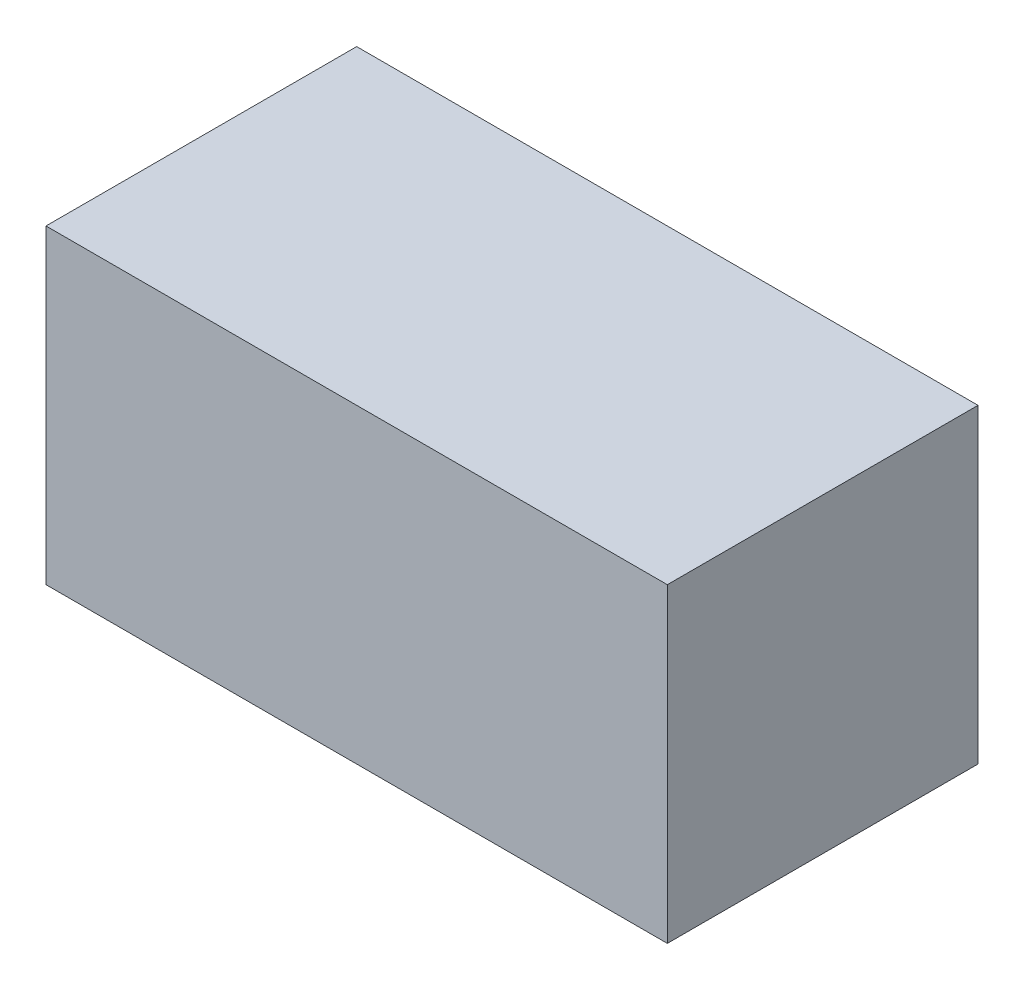
ISO-10303-21;
HEADER;
FILE_DESCRIPTION(('STEP AP214'),'2;1');
FILE_NAME('part.step','',(''),(''),'','','');
FILE_SCHEMA(('AUTOMOTIVE_DESIGN { 1 0 10303 214 1 1 1 1 }'));
ENDSEC;
DATA;
#1=APPLICATION_CONTEXT('core data for automotive mechanical design processes');
#2=APPLICATION_PROTOCOL_DEFINITION('international standard','automotive_design',2000,#1);
#3=PRODUCT_CONTEXT('',#1,'mechanical');
#4=PRODUCT('Part','Part','',(#3));
#5=PRODUCT_RELATED_PRODUCT_CATEGORY('part','',(#4));
#6=PRODUCT_DEFINITION_FORMATION('','',#4);
#7=PRODUCT_DEFINITION_CONTEXT('part definition',#1,'design');
#8=PRODUCT_DEFINITION('design','',#6,#7);
#9=PRODUCT_DEFINITION_SHAPE('','',#8);
#10=(LENGTH_UNIT() NAMED_UNIT(*) SI_UNIT(.MILLI.,.METRE.));
#11=(NAMED_UNIT(*) PLANE_ANGLE_UNIT() SI_UNIT($,.RADIAN.));
#12=(NAMED_UNIT(*) SI_UNIT($,.STERADIAN.) SOLID_ANGLE_UNIT());
#13=UNCERTAINTY_MEASURE_WITH_UNIT(LENGTH_MEASURE(1.E-05),#10,'distance_accuracy_value','');
#14=(GEOMETRIC_REPRESENTATION_CONTEXT(3) GLOBAL_UNCERTAINTY_ASSIGNED_CONTEXT((#13)) GLOBAL_UNIT_ASSIGNED_CONTEXT((#10,
#11,#12)) REPRESENTATION_CONTEXT('',''));
#15=CARTESIAN_POINT('',(0.,0.,0.));
#16=DIRECTION('',(0.,0.,1.));
#17=DIRECTION('',(1.,0.,0.));
#18=AXIS2_PLACEMENT_3D('',#15,#16,#17);
#19=CARTESIAN_POINT('',(0.,0.,5.));
#20=DIRECTION('',(1.,0.,0.));
#21=DIRECTION('',(0.,0.,-1.));
#22=AXIS2_PLACEMENT_3D('',#19,#20,#21);
#23=PLANE('',#22);
#24=DIRECTION('',(0.,-1.,0.));
#25=VECTOR('',#24,1.);
#26=CARTESIAN_POINT('',(0.,0.,-5.));
#27=LINE('',#26,#25);
#28=CARTESIAN_POINT('',(0.,10.,-5.));
#29=VERTEX_POINT('',#28);
#30=CARTESIAN_POINT('',(0.,0.,-5.));
#31=VERTEX_POINT('',#30);
#32=EDGE_CURVE('E96',#29,#31,#27,.T.);
#33=ORIENTED_EDGE('',*,*,#32,.T.);
#34=DIRECTION('',(0.,0.,-1.));
#35=VECTOR('',#34,1.);
#36=CARTESIAN_POINT('',(0.,0.,5.));
#37=LINE('',#36,#35);
#38=CARTESIAN_POINT('',(0.,0.,5.));
#39=VERTEX_POINT('',#38);
#40=EDGE_CURVE('E11',#39,#31,#37,.T.);
#41=ORIENTED_EDGE('',*,*,#40,.F.);
#42=DIRECTION('',(0.,-1.,0.));
#43=VECTOR('',#42,1.);
#44=CARTESIAN_POINT('',(0.,0.,5.));
#45=LINE('',#44,#43);
#46=CARTESIAN_POINT('',(0.,10.,5.));
#47=VERTEX_POINT('',#46);
#48=EDGE_CURVE('E84',#47,#39,#45,.T.);
#49=ORIENTED_EDGE('',*,*,#48,.F.);
#50=DIRECTION('',(0.,0.,-1.));
#51=VECTOR('',#50,1.);
#52=CARTESIAN_POINT('',(0.,10.,5.));
#53=LINE('',#52,#51);
#54=EDGE_CURVE('E92',#47,#29,#53,.T.);
#55=ORIENTED_EDGE('',*,*,#54,.T.);
#56=EDGE_LOOP('',(#33,#41,#49,#55));
#57=FACE_BOUND('',#56,.T.);
#58=ADVANCED_FACE('F33',(#57),#23,.F.);
#59=CARTESIAN_POINT('',(0.,0.,5.));
#60=DIRECTION('',(0.,1.,0.));
#61=DIRECTION('',(0.,0.,1.));
#62=AXIS2_PLACEMENT_3D('',#59,#60,#61);
#63=PLANE('',#62);
#64=DIRECTION('',(1.,0.,0.));
#65=VECTOR('',#64,1.);
#66=CARTESIAN_POINT('',(0.,0.,-5.));
#67=LINE('',#66,#65);
#68=CARTESIAN_POINT('',(20.,0.,-5.));
#69=VERTEX_POINT('',#68);
#70=EDGE_CURVE('E88',#31,#69,#67,.T.);
#71=ORIENTED_EDGE('',*,*,#70,.T.);
#72=DIRECTION('',(0.,0.,-1.));
#73=VECTOR('',#72,1.);
#74=CARTESIAN_POINT('',(20.,0.,5.));
#75=LINE('',#74,#73);
#76=CARTESIAN_POINT('',(20.,0.,5.));
#77=VERTEX_POINT('',#76);
#78=EDGE_CURVE('E41',#77,#69,#75,.T.);
#79=ORIENTED_EDGE('',*,*,#78,.F.);
#80=DIRECTION('',(1.,0.,0.));
#81=VECTOR('',#80,1.);
#82=CARTESIAN_POINT('',(0.,0.,5.));
#83=LINE('',#82,#81);
#84=EDGE_CURVE('E79',#39,#77,#83,.T.);
#85=ORIENTED_EDGE('',*,*,#84,.F.);
#86=ORIENTED_EDGE('',*,*,#40,.T.);
#87=EDGE_LOOP('',(#71,#79,#85,#86));
#88=FACE_BOUND('',#87,.T.);
#89=ADVANCED_FACE('F87',(#88),#63,.F.);
#90=CARTESIAN_POINT('',(20.,0.,5.));
#91=DIRECTION('',(-1.,0.,0.));
#92=DIRECTION('',(0.,0.,1.));
#93=AXIS2_PLACEMENT_3D('',#90,#91,#92);
#94=PLANE('',#93);
#95=DIRECTION('',(0.,1.,0.));
#96=VECTOR('',#95,1.);
#97=CARTESIAN_POINT('',(20.,0.,-5.));
#98=LINE('',#97,#96);
#99=CARTESIAN_POINT('',(20.,10.,-5.));
#100=VERTEX_POINT('',#99);
#101=EDGE_CURVE('E66',#69,#100,#98,.T.);
#102=ORIENTED_EDGE('',*,*,#101,.T.);
#103=DIRECTION('',(0.,0.,-1.));
#104=VECTOR('',#103,1.);
#105=CARTESIAN_POINT('',(20.,10.,5.));
#106=LINE('',#105,#104);
#107=CARTESIAN_POINT('',(20.,10.,5.));
#108=VERTEX_POINT('',#107);
#109=EDGE_CURVE('E89',#108,#100,#106,.T.);
#110=ORIENTED_EDGE('',*,*,#109,.F.);
#111=DIRECTION('',(0.,1.,0.));
#112=VECTOR('',#111,1.);
#113=CARTESIAN_POINT('',(20.,0.,5.));
#114=LINE('',#113,#112);
#115=EDGE_CURVE('E82',#77,#108,#114,.T.);
#116=ORIENTED_EDGE('',*,*,#115,.F.);
#117=ORIENTED_EDGE('',*,*,#78,.T.);
#118=EDGE_LOOP('',(#102,#110,#116,#117));
#119=FACE_BOUND('',#118,.T.);
#120=ADVANCED_FACE('F90',(#119),#94,.F.);
#121=CARTESIAN_POINT('',(0.,10.,5.));
#122=DIRECTION('',(0.,-1.,0.));
#123=DIRECTION('',(0.,0.,-1.));
#124=AXIS2_PLACEMENT_3D('',#121,#122,#123);
#125=PLANE('',#124);
#126=DIRECTION('',(-1.,0.,0.));
#127=VECTOR('',#126,1.);
#128=CARTESIAN_POINT('',(0.,10.,-5.));
#129=LINE('',#128,#127);
#130=EDGE_CURVE('E72',#100,#29,#129,.T.);
#131=ORIENTED_EDGE('',*,*,#130,.T.);
#132=ORIENTED_EDGE('',*,*,#54,.F.);
#133=DIRECTION('',(-1.,0.,0.));
#134=VECTOR('',#133,1.);
#135=CARTESIAN_POINT('',(0.,10.,5.));
#136=LINE('',#135,#134);
#137=EDGE_CURVE('E49',#108,#47,#136,.T.);
#138=ORIENTED_EDGE('',*,*,#137,.F.);
#139=ORIENTED_EDGE('',*,*,#109,.T.);
#140=EDGE_LOOP('',(#131,#132,#138,#139));
#141=FACE_BOUND('',#140,.T.);
#142=ADVANCED_FACE('F103',(#141),#125,.F.);
#143=CARTESIAN_POINT('',(0.,0.,5.));
#144=DIRECTION('',(0.,0.,-1.));
#145=DIRECTION('',(-1.,0.,0.));
#146=AXIS2_PLACEMENT_3D('',#143,#144,#145);
#147=PLANE('',#146);
#148=ORIENTED_EDGE('',*,*,#48,.T.);
#149=ORIENTED_EDGE('',*,*,#84,.T.);
#150=ORIENTED_EDGE('',*,*,#115,.T.);
#151=ORIENTED_EDGE('',*,*,#137,.T.);
#152=EDGE_LOOP('',(#148,#149,#150,#151));
#153=FACE_BOUND('',#152,.T.);
#154=ADVANCED_FACE('F80',(#153),#147,.F.);
#155=CARTESIAN_POINT('',(0.,0.,-5.));
#156=DIRECTION('',(0.,0.,-1.));
#157=DIRECTION('',(-1.,0.,0.));
#158=AXIS2_PLACEMENT_3D('',#155,#156,#157);
#159=PLANE('',#158);
#160=ORIENTED_EDGE('',*,*,#32,.F.);
#161=ORIENTED_EDGE('',*,*,#130,.F.);
#162=ORIENTED_EDGE('',*,*,#101,.F.);
#163=ORIENTED_EDGE('',*,*,#70,.F.);
#164=EDGE_LOOP('',(#160,#161,#162,#163));
#165=FACE_BOUND('',#164,.T.);
#166=ADVANCED_FACE('F106',(#165),#159,.T.);
#167=CLOSED_SHELL('',(#58,#89,#120,#142,#154,#166));
#168=MANIFOLD_SOLID_BREP('B2',#167);
#169=ADVANCED_BREP_SHAPE_REPRESENTATION('',(#18,#168),#14);
#170=SHAPE_DEFINITION_REPRESENTATION(#9,#169);
ENDSEC;
END-ISO-10303-21;
